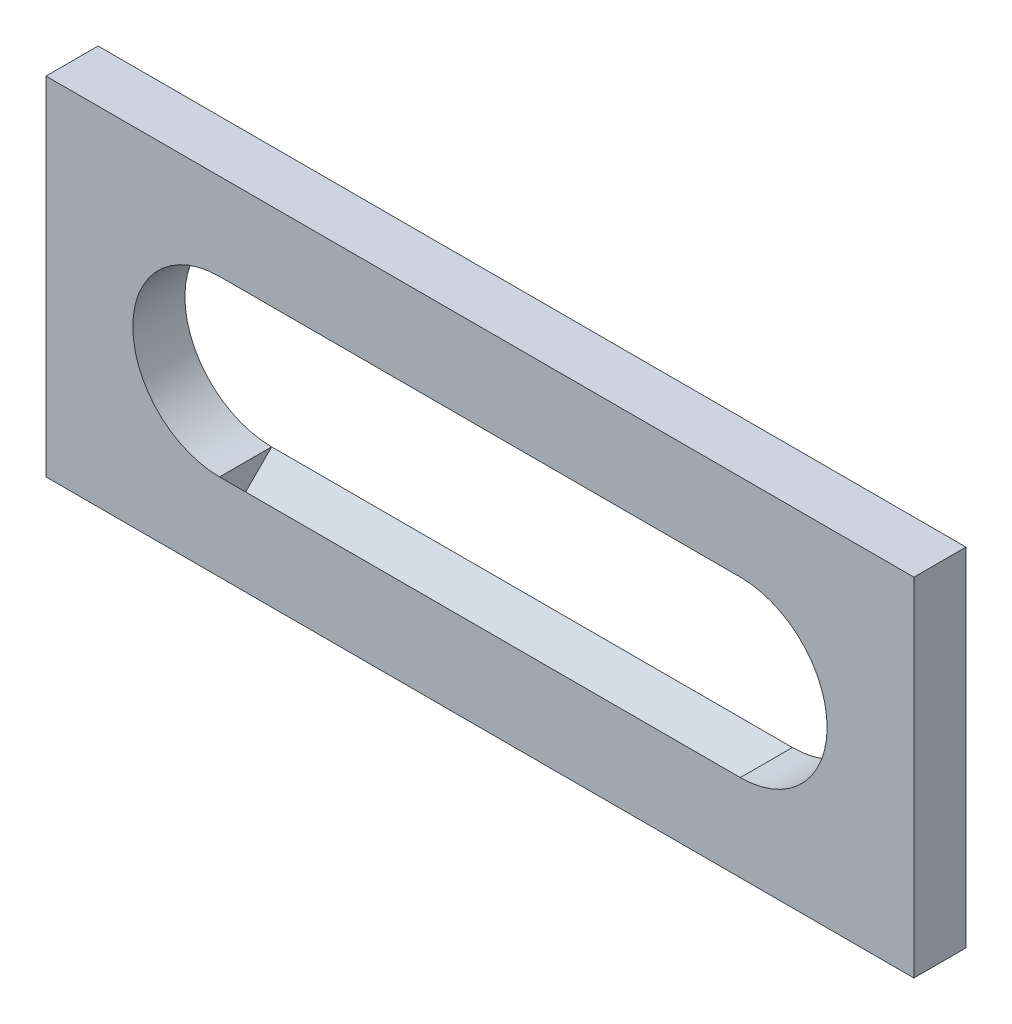
ISO-10303-21;
HEADER;
FILE_DESCRIPTION(('STEP AP214'),'2;1');
FILE_NAME('part.step','',(''),(''),'','','');
FILE_SCHEMA(('AUTOMOTIVE_DESIGN { 1 0 10303 214 1 1 1 1 }'));
ENDSEC;
DATA;
#1=APPLICATION_CONTEXT('core data for automotive mechanical design processes');
#2=APPLICATION_PROTOCOL_DEFINITION('international standard','automotive_design',2000,#1);
#3=PRODUCT_CONTEXT('',#1,'mechanical');
#4=PRODUCT('Part','Part','',(#3));
#5=PRODUCT_RELATED_PRODUCT_CATEGORY('part','',(#4));
#6=PRODUCT_DEFINITION_FORMATION('','',#4);
#7=PRODUCT_DEFINITION_CONTEXT('part definition',#1,'design');
#8=PRODUCT_DEFINITION('design','',#6,#7);
#9=PRODUCT_DEFINITION_SHAPE('','',#8);
#10=(LENGTH_UNIT() NAMED_UNIT(*) SI_UNIT(.MILLI.,.METRE.));
#11=(NAMED_UNIT(*) PLANE_ANGLE_UNIT() SI_UNIT($,.RADIAN.));
#12=(NAMED_UNIT(*) SI_UNIT($,.STERADIAN.) SOLID_ANGLE_UNIT());
#13=UNCERTAINTY_MEASURE_WITH_UNIT(LENGTH_MEASURE(1.E-05),#10,'distance_accuracy_value','');
#14=(GEOMETRIC_REPRESENTATION_CONTEXT(3) GLOBAL_UNCERTAINTY_ASSIGNED_CONTEXT((#13)) GLOBAL_UNIT_ASSIGNED_CONTEXT((#10,
#11,#12)) REPRESENTATION_CONTEXT('',''));
#15=CARTESIAN_POINT('',(0.,0.,0.));
#16=DIRECTION('',(0.,0.,1.));
#17=DIRECTION('',(1.,0.,0.));
#18=AXIS2_PLACEMENT_3D('',#15,#16,#17);
#19=CARTESIAN_POINT('',(-15.,6.5,0.));
#20=DIRECTION('',(-1.,0.,0.));
#21=DIRECTION('',(0.,0.,1.));
#22=AXIS2_PLACEMENT_3D('',#19,#20,#21);
#23=PLANE('',#22);
#24=DIRECTION('',(0.,-0.707106781186548,-0.707106781186547));
#25=VECTOR('',#24,1.);
#26=CARTESIAN_POINT('',(-15.,2.5,-2.5));
#27=LINE('',#26,#25);
#28=CARTESIAN_POINT('',(-15.,6.5,1.5));
#29=VERTEX_POINT('',#28);
#30=CARTESIAN_POINT('',(-15.,5.,0.));
#31=VERTEX_POINT('',#30);
#32=EDGE_CURVE('E457',#29,#31,#27,.T.);
#33=ORIENTED_EDGE('',*,*,#32,.F.);
#34=DIRECTION('',(0.,0.707106781186548,-0.707106781186547));
#35=VECTOR('',#34,1.);
#36=CARTESIAN_POINT('',(-15.,4.,4.));
#37=LINE('',#36,#35);
#38=CARTESIAN_POINT('',(-15.,5.,3.));
#39=VERTEX_POINT('',#38);
#40=EDGE_CURVE('E225',#39,#29,#37,.T.);
#41=ORIENTED_EDGE('',*,*,#40,.F.);
#42=DIRECTION('',(0.,0.,1.));
#43=VECTOR('',#42,1.);
#44=CARTESIAN_POINT('',(-15.,5.,0.));
#45=LINE('',#44,#43);
#46=EDGE_CURVE('E249',#39,#31,#45,.F.);
#47=ORIENTED_EDGE('',*,*,#46,.T.);
#48=EDGE_LOOP('',(#33,#41,#47));
#49=FACE_BOUND('',#48,.T.);
#50=ADVANCED_FACE('F107',(#49),#23,.F.);
#51=CARTESIAN_POINT('',(15.,6.5,0.));
#52=DIRECTION('',(1.,0.,0.));
#53=DIRECTION('',(0.,0.,-1.));
#54=AXIS2_PLACEMENT_3D('',#51,#52,#53);
#55=PLANE('',#54);
#56=DIRECTION('',(0.,-0.707106781186548,-0.707106781186547));
#57=VECTOR('',#56,1.);
#58=CARTESIAN_POINT('',(15.,2.5,-2.5));
#59=LINE('',#58,#57);
#60=CARTESIAN_POINT('',(15.,6.5,1.5));
#61=VERTEX_POINT('',#60);
#62=CARTESIAN_POINT('',(15.,5.,0.));
#63=VERTEX_POINT('',#62);
#64=EDGE_CURVE('E450',#61,#63,#59,.T.);
#65=ORIENTED_EDGE('',*,*,#64,.T.);
#66=DIRECTION('',(0.,0.,1.));
#67=VECTOR('',#66,1.);
#68=CARTESIAN_POINT('',(15.,5.,0.));
#69=LINE('',#68,#67);
#70=CARTESIAN_POINT('',(15.,5.,3.));
#71=VERTEX_POINT('',#70);
#72=EDGE_CURVE('E217',#63,#71,#69,.T.);
#73=ORIENTED_EDGE('',*,*,#72,.T.);
#74=DIRECTION('',(0.,0.707106781186548,-0.707106781186547));
#75=VECTOR('',#74,1.);
#76=CARTESIAN_POINT('',(15.,4.,4.));
#77=LINE('',#76,#75);
#78=EDGE_CURVE('E133',#71,#61,#77,.T.);
#79=ORIENTED_EDGE('',*,*,#78,.T.);
#80=EDGE_LOOP('',(#65,#73,#79));
#81=FACE_BOUND('',#80,.T.);
#82=ADVANCED_FACE('F284',(#81),#55,.F.);
#83=CARTESIAN_POINT('',(0.,0.,3.));
#84=DIRECTION('',(0.,0.,-1.));
#85=DIRECTION('',(-1.,0.,0.));
#86=AXIS2_PLACEMENT_3D('',#83,#84,#85);
#87=PLANE('',#86);
#88=CARTESIAN_POINT('',(15.,0.,3.));
#89=DIRECTION('',(0.,0.,1.));
#90=DIRECTION('',(1.,0.,0.));
#91=AXIS2_PLACEMENT_3D('',#88,#89,#90);
#92=CIRCLE('',#91,5.);
#93=CARTESIAN_POINT('',(15.,-5.,3.));
#94=VERTEX_POINT('',#93);
#95=EDGE_CURVE('E222',#94,#71,#92,.T.);
#96=ORIENTED_EDGE('',*,*,#95,.F.);
#97=DIRECTION('',(-1.,0.,0.));
#98=VECTOR('',#97,1.);
#99=CARTESIAN_POINT('',(25.002,-5.,3.));
#100=LINE('',#99,#98);
#101=CARTESIAN_POINT('',(-15.,-5.,3.));
#102=VERTEX_POINT('',#101);
#103=EDGE_CURVE('E444',#94,#102,#100,.T.);
#104=ORIENTED_EDGE('',*,*,#103,.T.);
#105=CARTESIAN_POINT('',(-15.,0.,3.));
#106=DIRECTION('',(0.,0.,1.));
#107=DIRECTION('',(1.,0.,0.));
#108=AXIS2_PLACEMENT_3D('',#105,#106,#107);
#109=CIRCLE('',#108,5.);
#110=EDGE_CURVE('E479',#39,#102,#109,.T.);
#111=ORIENTED_EDGE('',*,*,#110,.F.);
#112=DIRECTION('',(-1.,0.,0.));
#113=VECTOR('',#112,1.);
#114=CARTESIAN_POINT('',(25.002,5.,3.));
#115=LINE('',#114,#113);
#116=EDGE_CURVE('E467',#71,#39,#115,.T.);
#117=ORIENTED_EDGE('',*,*,#116,.F.);
#118=EDGE_LOOP('',(#96,#104,#111,#117));
#119=FACE_BOUND('',#118,.T.);
#120=DIRECTION('',(0.,1.,0.));
#121=VECTOR('',#120,1.);
#122=CARTESIAN_POINT('',(-25.,-9.99999999999999,3.));
#123=LINE('',#122,#121);
#124=CARTESIAN_POINT('',(-25.,-9.99999999999999,3.));
#125=VERTEX_POINT('',#124);
#126=CARTESIAN_POINT('',(-25.,10.,3.));
#127=VERTEX_POINT('',#126);
#128=EDGE_CURVE('E229',#125,#127,#123,.T.);
#129=ORIENTED_EDGE('',*,*,#128,.F.);
#130=DIRECTION('',(1.,0.,0.));
#131=VECTOR('',#130,1.);
#132=CARTESIAN_POINT('',(-25.,-9.99999999999999,3.));
#133=LINE('',#132,#131);
#134=CARTESIAN_POINT('',(25.,-9.99999999999999,3.));
#135=VERTEX_POINT('',#134);
#136=EDGE_CURVE('E241',#125,#135,#133,.T.);
#137=ORIENTED_EDGE('',*,*,#136,.T.);
#138=DIRECTION('',(0.,1.,0.));
#139=VECTOR('',#138,1.);
#140=CARTESIAN_POINT('',(25.,-9.99999999999999,3.));
#141=LINE('',#140,#139);
#142=CARTESIAN_POINT('',(25.,10.,3.));
#143=VERTEX_POINT('',#142);
#144=EDGE_CURVE('E238',#135,#143,#141,.T.);
#145=ORIENTED_EDGE('',*,*,#144,.T.);
#146=DIRECTION('',(1.,0.,0.));
#147=VECTOR('',#146,1.);
#148=CARTESIAN_POINT('',(-25.,10.,3.));
#149=LINE('',#148,#147);
#150=EDGE_CURVE('E233',#127,#143,#149,.T.);
#151=ORIENTED_EDGE('',*,*,#150,.F.);
#152=EDGE_LOOP('',(#129,#137,#145,#151));
#153=FACE_BOUND('',#152,.T.);
#154=ADVANCED_FACE('F282',(#119,#153),#87,.F.);
#155=CARTESIAN_POINT('',(0.,0.,0.));
#156=DIRECTION('',(0.,0.,-1.));
#157=DIRECTION('',(-1.,0.,0.));
#158=AXIS2_PLACEMENT_3D('',#155,#156,#157);
#159=PLANE('',#158);
#160=DIRECTION('',(-1.,0.,0.));
#161=VECTOR('',#160,1.);
#162=CARTESIAN_POINT('',(25.002,-4.99999999999999,0.));
#163=LINE('',#162,#161);
#164=CARTESIAN_POINT('',(15.,-5.,0.));
#165=VERTEX_POINT('',#164);
#166=CARTESIAN_POINT('',(-15.,-5.,0.));
#167=VERTEX_POINT('',#166);
#168=EDGE_CURVE('E187',#165,#167,#163,.T.);
#169=ORIENTED_EDGE('',*,*,#168,.F.);
#170=CARTESIAN_POINT('',(15.,0.,0.));
#171=DIRECTION('',(0.,0.,1.));
#172=DIRECTION('',(1.,0.,0.));
#173=AXIS2_PLACEMENT_3D('',#170,#171,#172);
#174=CIRCLE('',#173,5.);
#175=EDGE_CURVE('E202',#165,#63,#174,.T.);
#176=ORIENTED_EDGE('',*,*,#175,.T.);
#177=DIRECTION('',(-1.,0.,0.));
#178=VECTOR('',#177,1.);
#179=CARTESIAN_POINT('',(25.002,5.,0.));
#180=LINE('',#179,#178);
#181=EDGE_CURVE('E458',#63,#31,#180,.T.);
#182=ORIENTED_EDGE('',*,*,#181,.T.);
#183=CARTESIAN_POINT('',(-15.,0.,0.));
#184=DIRECTION('',(0.,0.,1.));
#185=DIRECTION('',(1.,0.,0.));
#186=AXIS2_PLACEMENT_3D('',#183,#184,#185);
#187=CIRCLE('',#186,5.);
#188=EDGE_CURVE('E205',#31,#167,#187,.T.);
#189=ORIENTED_EDGE('',*,*,#188,.T.);
#190=EDGE_LOOP('',(#169,#176,#182,#189));
#191=FACE_BOUND('',#190,.T.);
#192=DIRECTION('',(0.,1.,0.));
#193=VECTOR('',#192,1.);
#194=CARTESIAN_POINT('',(-25.,-9.99999999999999,0.));
#195=LINE('',#194,#193);
#196=CARTESIAN_POINT('',(-25.,-9.99999999999999,0.));
#197=VERTEX_POINT('',#196);
#198=CARTESIAN_POINT('',(-25.,10.,0.));
#199=VERTEX_POINT('',#198);
#200=EDGE_CURVE('E244',#197,#199,#195,.T.);
#201=ORIENTED_EDGE('',*,*,#200,.T.);
#202=DIRECTION('',(1.,0.,0.));
#203=VECTOR('',#202,1.);
#204=CARTESIAN_POINT('',(-25.,10.,0.));
#205=LINE('',#204,#203);
#206=CARTESIAN_POINT('',(25.,10.,0.));
#207=VERTEX_POINT('',#206);
#208=EDGE_CURVE('E248',#199,#207,#205,.T.);
#209=ORIENTED_EDGE('',*,*,#208,.T.);
#210=DIRECTION('',(0.,1.,0.));
#211=VECTOR('',#210,1.);
#212=CARTESIAN_POINT('',(25.,-9.99999999999999,0.));
#213=LINE('',#212,#211);
#214=CARTESIAN_POINT('',(25.,-9.99999999999999,0.));
#215=VERTEX_POINT('',#214);
#216=EDGE_CURVE('E253',#215,#207,#213,.T.);
#217=ORIENTED_EDGE('',*,*,#216,.F.);
#218=DIRECTION('',(1.,0.,0.));
#219=VECTOR('',#218,1.);
#220=CARTESIAN_POINT('',(-25.,-9.99999999999999,0.));
#221=LINE('',#220,#219);
#222=EDGE_CURVE('E234',#197,#215,#221,.T.);
#223=ORIENTED_EDGE('',*,*,#222,.F.);
#224=EDGE_LOOP('',(#201,#209,#217,#223));
#225=FACE_BOUND('',#224,.T.);
#226=ADVANCED_FACE('F198',(#191,#225),#159,.T.);
#227=CARTESIAN_POINT('',(-25.,-9.99999999999999,3.));
#228=DIRECTION('',(-1.,0.,0.));
#229=DIRECTION('',(0.,0.,1.));
#230=AXIS2_PLACEMENT_3D('',#227,#228,#229);
#231=PLANE('',#230);
#232=ORIENTED_EDGE('',*,*,#200,.F.);
#233=DIRECTION('',(0.,0.,-1.));
#234=VECTOR('',#233,1.);
#235=CARTESIAN_POINT('',(-25.,-9.99999999999999,3.));
#236=LINE('',#235,#234);
#237=EDGE_CURVE('E12',#125,#197,#236,.T.);
#238=ORIENTED_EDGE('',*,*,#237,.F.);
#239=ORIENTED_EDGE('',*,*,#128,.T.);
#240=DIRECTION('',(0.,0.,-1.));
#241=VECTOR('',#240,1.);
#242=CARTESIAN_POINT('',(-25.,10.,3.));
#243=LINE('',#242,#241);
#244=EDGE_CURVE('E111',#127,#199,#243,.T.);
#245=ORIENTED_EDGE('',*,*,#244,.T.);
#246=EDGE_LOOP('',(#232,#238,#239,#245));
#247=FACE_BOUND('',#246,.T.);
#248=ADVANCED_FACE('F109',(#247),#231,.T.);
#249=CARTESIAN_POINT('',(-25.,-9.99999999999999,3.));
#250=DIRECTION('',(0.,1.,0.));
#251=DIRECTION('',(0.,0.,1.));
#252=AXIS2_PLACEMENT_3D('',#249,#250,#251);
#253=PLANE('',#252);
#254=ORIENTED_EDGE('',*,*,#222,.T.);
#255=DIRECTION('',(0.,0.,-1.));
#256=VECTOR('',#255,1.);
#257=CARTESIAN_POINT('',(25.,-9.99999999999999,3.));
#258=LINE('',#257,#256);
#259=EDGE_CURVE('E117',#135,#215,#258,.T.);
#260=ORIENTED_EDGE('',*,*,#259,.F.);
#261=ORIENTED_EDGE('',*,*,#136,.F.);
#262=ORIENTED_EDGE('',*,*,#237,.T.);
#263=EDGE_LOOP('',(#254,#260,#261,#262));
#264=FACE_BOUND('',#263,.T.);
#265=ADVANCED_FACE('F276',(#264),#253,.F.);
#266=CARTESIAN_POINT('',(25.,-9.99999999999999,3.));
#267=DIRECTION('',(-1.,0.,0.));
#268=DIRECTION('',(0.,0.,1.));
#269=AXIS2_PLACEMENT_3D('',#266,#267,#268);
#270=PLANE('',#269);
#271=ORIENTED_EDGE('',*,*,#216,.T.);
#272=DIRECTION('',(0.,0.,-1.));
#273=VECTOR('',#272,1.);
#274=CARTESIAN_POINT('',(25.,10.,3.));
#275=LINE('',#274,#273);
#276=EDGE_CURVE('E261',#143,#207,#275,.T.);
#277=ORIENTED_EDGE('',*,*,#276,.F.);
#278=ORIENTED_EDGE('',*,*,#144,.F.);
#279=ORIENTED_EDGE('',*,*,#259,.T.);
#280=EDGE_LOOP('',(#271,#277,#278,#279));
#281=FACE_BOUND('',#280,.T.);
#282=ADVANCED_FACE('F280',(#281),#270,.F.);
#283=CARTESIAN_POINT('',(-25.,10.,3.));
#284=DIRECTION('',(0.,1.,0.));
#285=DIRECTION('',(0.,0.,1.));
#286=AXIS2_PLACEMENT_3D('',#283,#284,#285);
#287=PLANE('',#286);
#288=ORIENTED_EDGE('',*,*,#208,.F.);
#289=ORIENTED_EDGE('',*,*,#244,.F.);
#290=ORIENTED_EDGE('',*,*,#150,.T.);
#291=ORIENTED_EDGE('',*,*,#276,.T.);
#292=EDGE_LOOP('',(#288,#289,#290,#291));
#293=FACE_BOUND('',#292,.T.);
#294=ADVANCED_FACE('F271',(#293),#287,.T.);
#295=CARTESIAN_POINT('',(-15.,0.,0.));
#296=DIRECTION('',(0.,0.,1.));
#297=DIRECTION('',(1.,0.,0.));
#298=AXIS2_PLACEMENT_3D('',#295,#296,#297);
#299=CYLINDRICAL_SURFACE('',#298,5.);
#300=ORIENTED_EDGE('',*,*,#110,.T.);
#301=DIRECTION('',(0.,0.,1.));
#302=VECTOR('',#301,1.);
#303=CARTESIAN_POINT('',(-15.,-5.,0.));
#304=LINE('',#303,#302);
#305=EDGE_CURVE('E478',#102,#167,#304,.F.);
#306=ORIENTED_EDGE('',*,*,#305,.T.);
#307=ORIENTED_EDGE('',*,*,#188,.F.);
#308=ORIENTED_EDGE('',*,*,#46,.F.);
#309=EDGE_LOOP('',(#300,#306,#307,#308));
#310=FACE_BOUND('',#309,.T.);
#311=ADVANCED_FACE('F302',(#310),#299,.F.);
#312=CARTESIAN_POINT('',(15.,0.,0.));
#313=DIRECTION('',(0.,0.,1.));
#314=DIRECTION('',(1.,0.,0.));
#315=AXIS2_PLACEMENT_3D('',#312,#313,#314);
#316=CYLINDRICAL_SURFACE('',#315,5.);
#317=ORIENTED_EDGE('',*,*,#175,.F.);
#318=DIRECTION('',(0.,0.,1.));
#319=VECTOR('',#318,1.);
#320=CARTESIAN_POINT('',(15.,-5.,0.));
#321=LINE('',#320,#319);
#322=EDGE_CURVE('E210',#165,#94,#321,.T.);
#323=ORIENTED_EDGE('',*,*,#322,.T.);
#324=ORIENTED_EDGE('',*,*,#95,.T.);
#325=ORIENTED_EDGE('',*,*,#72,.F.);
#326=EDGE_LOOP('',(#317,#323,#324,#325));
#327=FACE_BOUND('',#326,.T.);
#328=ADVANCED_FACE('F220',(#327),#316,.F.);
#329=CARTESIAN_POINT('',(25.002,4.,4.));
#330=DIRECTION('',(0.,0.707106781186547,0.707106781186548));
#331=DIRECTION('',(0.,-0.707106781186548,0.707106781186547));
#332=AXIS2_PLACEMENT_3D('',#329,#330,#331);
#333=PLANE('',#332);
#334=ORIENTED_EDGE('',*,*,#78,.F.);
#335=ORIENTED_EDGE('',*,*,#116,.T.);
#336=ORIENTED_EDGE('',*,*,#40,.T.);
#337=DIRECTION('',(-1.,0.,0.));
#338=VECTOR('',#337,1.);
#339=CARTESIAN_POINT('',(25.002,6.5,1.5));
#340=LINE('',#339,#338);
#341=EDGE_CURVE('E466',#61,#29,#340,.T.);
#342=ORIENTED_EDGE('',*,*,#341,.F.);
#343=EDGE_LOOP('',(#334,#335,#336,#342));
#344=FACE_BOUND('',#343,.T.);
#345=ADVANCED_FACE('F306',(#344),#333,.F.);
#346=CARTESIAN_POINT('',(25.002,2.5,-2.5));
#347=DIRECTION('',(0.,0.707106781186547,-0.707106781186548));
#348=DIRECTION('',(0.,0.707106781186548,0.707106781186547));
#349=AXIS2_PLACEMENT_3D('',#346,#347,#348);
#350=PLANE('',#349);
#351=ORIENTED_EDGE('',*,*,#64,.F.);
#352=ORIENTED_EDGE('',*,*,#341,.T.);
#353=ORIENTED_EDGE('',*,*,#32,.T.);
#354=ORIENTED_EDGE('',*,*,#181,.F.);
#355=EDGE_LOOP('',(#351,#352,#353,#354));
#356=FACE_BOUND('',#355,.T.);
#357=ADVANCED_FACE('F310',(#356),#350,.F.);
#358=CARTESIAN_POINT('',(15.,-6.5,3.));
#359=DIRECTION('',(1.,0.,0.));
#360=DIRECTION('',(0.,1.,0.));
#361=AXIS2_PLACEMENT_3D('',#358,#359,#360);
#362=PLANE('',#361);
#363=ORIENTED_EDGE('',*,*,#322,.F.);
#364=DIRECTION('',(0.,0.707106781186549,-0.707106781186546));
#365=VECTOR('',#364,1.);
#366=CARTESIAN_POINT('',(15.,-2.49999999999999,-2.5));
#367=LINE('',#366,#365);
#368=CARTESIAN_POINT('',(15.,-6.5,1.5));
#369=VERTEX_POINT('',#368);
#370=EDGE_CURVE('E184',#369,#165,#367,.T.);
#371=ORIENTED_EDGE('',*,*,#370,.F.);
#372=DIRECTION('',(0.,-0.707106781186548,-0.707106781186547));
#373=VECTOR('',#372,1.);
#374=CARTESIAN_POINT('',(15.,-3.99999999999999,4.));
#375=LINE('',#374,#373);
#376=EDGE_CURVE('E212',#94,#369,#375,.T.);
#377=ORIENTED_EDGE('',*,*,#376,.F.);
#378=EDGE_LOOP('',(#363,#371,#377));
#379=FACE_BOUND('',#378,.T.);
#380=ADVANCED_FACE('F211',(#379),#362,.F.);
#381=CARTESIAN_POINT('',(-15.,-6.5,3.));
#382=DIRECTION('',(-1.,0.,0.));
#383=DIRECTION('',(0.,-1.,0.));
#384=AXIS2_PLACEMENT_3D('',#381,#382,#383);
#385=PLANE('',#384);
#386=DIRECTION('',(0.,-0.707106781186548,-0.707106781186547));
#387=VECTOR('',#386,1.);
#388=CARTESIAN_POINT('',(-15.,-4.,4.));
#389=LINE('',#388,#387);
#390=CARTESIAN_POINT('',(-15.,-6.5,1.5));
#391=VERTEX_POINT('',#390);
#392=EDGE_CURVE('E207',#102,#391,#389,.T.);
#393=ORIENTED_EDGE('',*,*,#392,.T.);
#394=DIRECTION('',(0.,0.707106781186549,-0.707106781186546));
#395=VECTOR('',#394,1.);
#396=CARTESIAN_POINT('',(-15.,-2.49999999999999,-2.5));
#397=LINE('',#396,#395);
#398=EDGE_CURVE('E125',#391,#167,#397,.T.);
#399=ORIENTED_EDGE('',*,*,#398,.T.);
#400=ORIENTED_EDGE('',*,*,#305,.F.);
#401=EDGE_LOOP('',(#393,#399,#400));
#402=FACE_BOUND('',#401,.T.);
#403=ADVANCED_FACE('F320',(#402),#385,.F.);
#404=CARTESIAN_POINT('',(25.002,-3.99999999999999,4.));
#405=DIRECTION('',(0.,0.707106781186547,-0.707106781186548));
#406=DIRECTION('',(0.,0.707106781186548,0.707106781186547));
#407=AXIS2_PLACEMENT_3D('',#404,#405,#406);
#408=PLANE('',#407);
#409=ORIENTED_EDGE('',*,*,#103,.F.);
#410=ORIENTED_EDGE('',*,*,#376,.T.);
#411=DIRECTION('',(-1.,0.,0.));
#412=VECTOR('',#411,1.);
#413=CARTESIAN_POINT('',(25.002,-6.5,1.5));
#414=LINE('',#413,#412);
#415=EDGE_CURVE('E189',#369,#391,#414,.T.);
#416=ORIENTED_EDGE('',*,*,#415,.T.);
#417=ORIENTED_EDGE('',*,*,#392,.F.);
#418=EDGE_LOOP('',(#409,#410,#416,#417));
#419=FACE_BOUND('',#418,.T.);
#420=ADVANCED_FACE('F323',(#419),#408,.T.);
#421=CARTESIAN_POINT('',(25.002,-2.49999999999999,-2.5));
#422=DIRECTION('',(0.,0.707106781186546,0.707106781186549));
#423=DIRECTION('',(0.,-0.707106781186549,0.707106781186546));
#424=AXIS2_PLACEMENT_3D('',#421,#422,#423);
#425=PLANE('',#424);
#426=ORIENTED_EDGE('',*,*,#415,.F.);
#427=ORIENTED_EDGE('',*,*,#370,.T.);
#428=ORIENTED_EDGE('',*,*,#168,.T.);
#429=ORIENTED_EDGE('',*,*,#398,.F.);
#430=EDGE_LOOP('',(#426,#427,#428,#429));
#431=FACE_BOUND('',#430,.T.);
#432=ADVANCED_FACE('F186',(#431),#425,.T.);
#433=CLOSED_SHELL('',(#50,#82,#154,#226,#248,#265,#282,#294,#311,#328,#345,#357,#380,#403,#420,#432));
#434=MANIFOLD_SOLID_BREP('B2',#433);
#435=ADVANCED_BREP_SHAPE_REPRESENTATION('',(#18,#434),#14);
#436=SHAPE_DEFINITION_REPRESENTATION(#9,#435);
ENDSEC;
END-ISO-10303-21;
